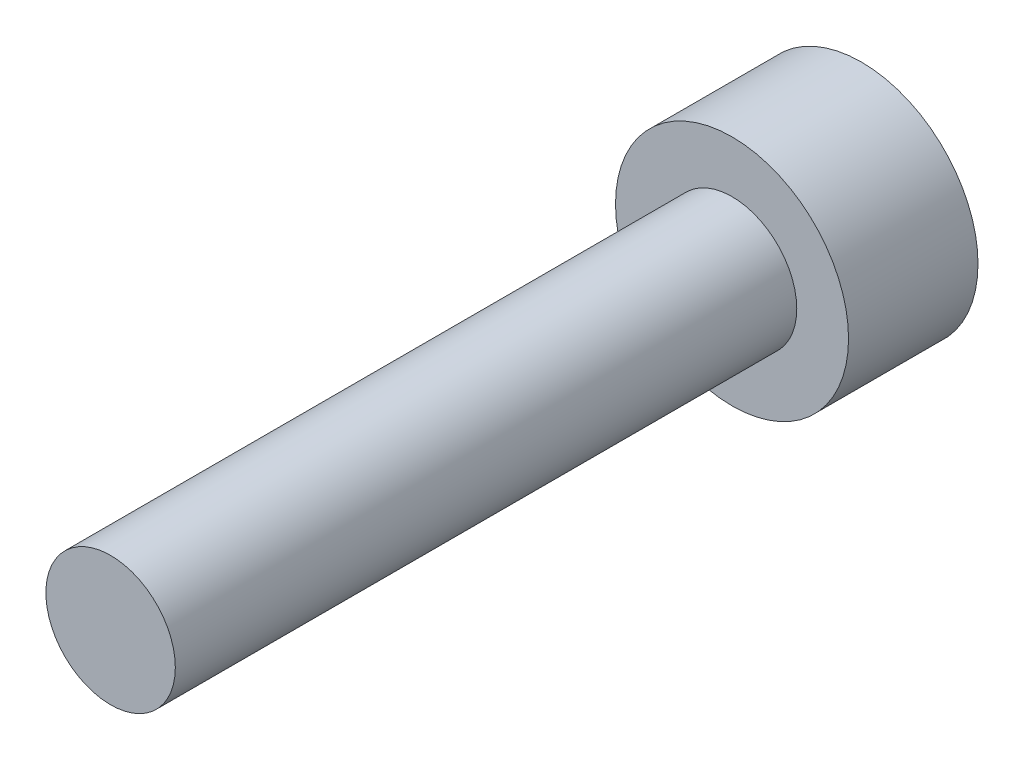
ISO-10303-21;
HEADER;
FILE_DESCRIPTION(('STEP AP214'),'2;1');
FILE_NAME('part.step','',(''),(''),'','','');
FILE_SCHEMA(('AUTOMOTIVE_DESIGN { 1 0 10303 214 1 1 1 1 }'));
ENDSEC;
DATA;
#1=APPLICATION_CONTEXT('core data for automotive mechanical design processes');
#2=APPLICATION_PROTOCOL_DEFINITION('international standard','automotive_design',2000,#1);
#3=PRODUCT_CONTEXT('',#1,'mechanical');
#4=PRODUCT('Part','Part','',(#3));
#5=PRODUCT_RELATED_PRODUCT_CATEGORY('part','',(#4));
#6=PRODUCT_DEFINITION_FORMATION('','',#4);
#7=PRODUCT_DEFINITION_CONTEXT('part definition',#1,'design');
#8=PRODUCT_DEFINITION('design','',#6,#7);
#9=PRODUCT_DEFINITION_SHAPE('','',#8);
#10=(LENGTH_UNIT() NAMED_UNIT(*) SI_UNIT(.MILLI.,.METRE.));
#11=(NAMED_UNIT(*) PLANE_ANGLE_UNIT() SI_UNIT($,.RADIAN.));
#12=(NAMED_UNIT(*) SI_UNIT($,.STERADIAN.) SOLID_ANGLE_UNIT());
#13=UNCERTAINTY_MEASURE_WITH_UNIT(LENGTH_MEASURE(1.E-05),#10,'distance_accuracy_value','');
#14=(GEOMETRIC_REPRESENTATION_CONTEXT(3) GLOBAL_UNCERTAINTY_ASSIGNED_CONTEXT((#13)) GLOBAL_UNIT_ASSIGNED_CONTEXT((#10,
#11,#12)) REPRESENTATION_CONTEXT('',''));
#15=CARTESIAN_POINT('',(0.,0.,0.));
#16=DIRECTION('',(0.,0.,1.));
#17=DIRECTION('',(1.,0.,0.));
#18=AXIS2_PLACEMENT_3D('',#15,#16,#17);
#19=CARTESIAN_POINT('',(0.,0.,2.5));
#20=DIRECTION('',(0.,0.,-1.));
#21=DIRECTION('',(-1.,0.,0.));
#22=AXIS2_PLACEMENT_3D('',#19,#20,#21);
#23=CYLINDRICAL_SURFACE('',#22,2.25);
#24=CARTESIAN_POINT('',(0.,0.,2.5));
#25=DIRECTION('',(0.,0.,1.));
#26=DIRECTION('',(1.,0.,0.));
#27=AXIS2_PLACEMENT_3D('',#24,#25,#26);
#28=CIRCLE('',#27,2.25);
#29=CARTESIAN_POINT('',(2.25,0.,2.5));
#30=VERTEX_POINT('',#29);
#31=EDGE_CURVE('E11',#30,#30,#28,.T.);
#32=ORIENTED_EDGE('',*,*,#31,.F.);
#33=EDGE_LOOP('',(#32));
#34=FACE_BOUND('',#33,.T.);
#35=CARTESIAN_POINT('',(0.,0.,0.));
#36=DIRECTION('',(0.,0.,1.));
#37=DIRECTION('',(1.,0.,0.));
#38=AXIS2_PLACEMENT_3D('',#35,#36,#37);
#39=CIRCLE('',#38,2.25);
#40=CARTESIAN_POINT('',(2.25,0.,0.));
#41=VERTEX_POINT('',#40);
#42=EDGE_CURVE('E39',#41,#41,#39,.T.);
#43=ORIENTED_EDGE('',*,*,#42,.T.);
#44=EDGE_LOOP('',(#43));
#45=FACE_BOUND('',#44,.T.);
#46=ADVANCED_FACE('F36',(#34,#45),#23,.T.);
#47=CARTESIAN_POINT('',(0.,0.,2.5));
#48=DIRECTION('',(0.,0.,1.));
#49=DIRECTION('',(1.,0.,0.));
#50=AXIS2_PLACEMENT_3D('',#47,#48,#49);
#51=PLANE('',#50);
#52=CARTESIAN_POINT('',(0.,0.,2.5));
#53=DIRECTION('',(0.,0.,1.));
#54=DIRECTION('',(1.,0.,0.));
#55=AXIS2_PLACEMENT_3D('',#52,#53,#54);
#56=CIRCLE('',#55,1.25);
#57=CARTESIAN_POINT('',(1.25,0.,2.5));
#58=VERTEX_POINT('',#57);
#59=EDGE_CURVE('E137',#58,#58,#56,.T.);
#60=ORIENTED_EDGE('',*,*,#59,.F.);
#61=EDGE_LOOP('',(#60));
#62=FACE_BOUND('',#61,.T.);
#63=ORIENTED_EDGE('',*,*,#31,.T.);
#64=EDGE_LOOP('',(#63));
#65=FACE_BOUND('',#64,.T.);
#66=ADVANCED_FACE('F151',(#62,#65),#51,.T.);
#67=CARTESIAN_POINT('',(0.,0.,0.));
#68=DIRECTION('',(0.,0.,1.));
#69=DIRECTION('',(1.,0.,0.));
#70=AXIS2_PLACEMENT_3D('',#67,#68,#69);
#71=PLANE('',#70);
#72=DIRECTION('',(0.5,0.866025403784438,0.));
#73=VECTOR('',#72,1.);
#74=CARTESIAN_POINT('',(-1.15470053837925,0.,0.));
#75=LINE('',#74,#73);
#76=CARTESIAN_POINT('',(-1.15470053837925,0.,0.));
#77=VERTEX_POINT('',#76);
#78=CARTESIAN_POINT('',(-0.577350269189626,1.,0.));
#79=VERTEX_POINT('',#78);
#80=EDGE_CURVE('E124',#77,#79,#75,.T.);
#81=ORIENTED_EDGE('',*,*,#80,.F.);
#82=DIRECTION('',(-0.5,0.866025403784439,0.));
#83=VECTOR('',#82,1.);
#84=CARTESIAN_POINT('',(-0.577350269189626,-1.,0.));
#85=LINE('',#84,#83);
#86=CARTESIAN_POINT('',(-0.577350269189626,-1.,0.));
#87=VERTEX_POINT('',#86);
#88=EDGE_CURVE('E50',#87,#77,#85,.T.);
#89=ORIENTED_EDGE('',*,*,#88,.F.);
#90=DIRECTION('',(-1.,0.,0.));
#91=VECTOR('',#90,1.);
#92=CARTESIAN_POINT('',(0.577350269189626,-1.,0.));
#93=LINE('',#92,#91);
#94=CARTESIAN_POINT('',(0.577350269189626,-1.,0.));
#95=VERTEX_POINT('',#94);
#96=EDGE_CURVE('E133',#95,#87,#93,.T.);
#97=ORIENTED_EDGE('',*,*,#96,.F.);
#98=DIRECTION('',(-0.5,-0.866025403784438,0.));
#99=VECTOR('',#98,1.);
#100=CARTESIAN_POINT('',(1.15470053837925,0.,0.));
#101=LINE('',#100,#99);
#102=CARTESIAN_POINT('',(1.15470053837925,0.,0.));
#103=VERTEX_POINT('',#102);
#104=EDGE_CURVE('E131',#103,#95,#101,.T.);
#105=ORIENTED_EDGE('',*,*,#104,.F.);
#106=DIRECTION('',(0.5,-0.866025403784439,0.));
#107=VECTOR('',#106,1.);
#108=CARTESIAN_POINT('',(0.577350269189626,1.,0.));
#109=LINE('',#108,#107);
#110=CARTESIAN_POINT('',(0.577350269189626,1.,0.));
#111=VERTEX_POINT('',#110);
#112=EDGE_CURVE('E98',#111,#103,#109,.T.);
#113=ORIENTED_EDGE('',*,*,#112,.F.);
#114=DIRECTION('',(1.,0.,0.));
#115=VECTOR('',#114,1.);
#116=CARTESIAN_POINT('',(-0.577350269189626,1.,0.));
#117=LINE('',#116,#115);
#118=EDGE_CURVE('E127',#79,#111,#117,.T.);
#119=ORIENTED_EDGE('',*,*,#118,.F.);
#120=EDGE_LOOP('',(#81,#89,#97,#105,#113,#119));
#121=FACE_BOUND('',#120,.T.);
#122=ORIENTED_EDGE('',*,*,#42,.F.);
#123=EDGE_LOOP('',(#122));
#124=FACE_BOUND('',#123,.T.);
#125=ADVANCED_FACE('F154',(#121,#124),#71,.F.);
#126=CARTESIAN_POINT('',(0.,0.,14.5));
#127=DIRECTION('',(0.,0.,-1.));
#128=DIRECTION('',(-1.,0.,0.));
#129=AXIS2_PLACEMENT_3D('',#126,#127,#128);
#130=CYLINDRICAL_SURFACE('',#129,1.25);
#131=CARTESIAN_POINT('',(0.,0.,14.5));
#132=DIRECTION('',(0.,0.,1.));
#133=DIRECTION('',(1.,0.,0.));
#134=AXIS2_PLACEMENT_3D('',#131,#132,#133);
#135=CIRCLE('',#134,1.25);
#136=CARTESIAN_POINT('',(1.25,0.,14.5));
#137=VERTEX_POINT('',#136);
#138=EDGE_CURVE('E143',#137,#137,#135,.T.);
#139=ORIENTED_EDGE('',*,*,#138,.F.);
#140=EDGE_LOOP('',(#139));
#141=FACE_BOUND('',#140,.T.);
#142=ORIENTED_EDGE('',*,*,#59,.T.);
#143=EDGE_LOOP('',(#142));
#144=FACE_BOUND('',#143,.T.);
#145=ADVANCED_FACE('F149',(#141,#144),#130,.T.);
#146=CARTESIAN_POINT('',(0.,0.,14.5));
#147=DIRECTION('',(0.,0.,1.));
#148=DIRECTION('',(1.,0.,0.));
#149=AXIS2_PLACEMENT_3D('',#146,#147,#148);
#150=PLANE('',#149);
#151=ORIENTED_EDGE('',*,*,#138,.T.);
#152=EDGE_LOOP('',(#151));
#153=FACE_BOUND('',#152,.T.);
#154=ADVANCED_FACE('F168',(#153),#150,.T.);
#155=CARTESIAN_POINT('',(-0.577350269189626,-1.,1.));
#156=DIRECTION('',(-0.866025403784439,-0.5,0.));
#157=DIRECTION('',(0.5,-0.866025403784439,0.));
#158=AXIS2_PLACEMENT_3D('',#155,#156,#157);
#159=PLANE('',#158);
#160=ORIENTED_EDGE('',*,*,#88,.T.);
#161=DIRECTION('',(0.,0.,-1.));
#162=VECTOR('',#161,1.);
#163=CARTESIAN_POINT('',(-1.15470053837925,0.,1.));
#164=LINE('',#163,#162);
#165=CARTESIAN_POINT('',(-1.15470053837925,0.,1.));
#166=VERTEX_POINT('',#165);
#167=EDGE_CURVE('E80',#166,#77,#164,.T.);
#168=ORIENTED_EDGE('',*,*,#167,.F.);
#169=DIRECTION('',(-0.5,0.866025403784439,0.));
#170=VECTOR('',#169,1.);
#171=CARTESIAN_POINT('',(-0.577350269189626,-1.,1.));
#172=LINE('',#171,#170);
#173=CARTESIAN_POINT('',(-0.577350269189626,-1.,1.));
#174=VERTEX_POINT('',#173);
#175=EDGE_CURVE('E135',#174,#166,#172,.T.);
#176=ORIENTED_EDGE('',*,*,#175,.F.);
#177=DIRECTION('',(0.,0.,-1.));
#178=VECTOR('',#177,1.);
#179=CARTESIAN_POINT('',(-0.577350269189626,-1.,1.));
#180=LINE('',#179,#178);
#181=EDGE_CURVE('E58',#174,#87,#180,.T.);
#182=ORIENTED_EDGE('',*,*,#181,.T.);
#183=EDGE_LOOP('',(#160,#168,#176,#182));
#184=FACE_BOUND('',#183,.T.);
#185=ADVANCED_FACE('F175',(#184),#159,.F.);
#186=CARTESIAN_POINT('',(0.577350269189626,-1.,1.));
#187=DIRECTION('',(0.,-1.,0.));
#188=DIRECTION('',(0.,0.,-1.));
#189=AXIS2_PLACEMENT_3D('',#186,#187,#188);
#190=PLANE('',#189);
#191=ORIENTED_EDGE('',*,*,#96,.T.);
#192=ORIENTED_EDGE('',*,*,#181,.F.);
#193=DIRECTION('',(-1.,0.,0.));
#194=VECTOR('',#193,1.);
#195=CARTESIAN_POINT('',(0.577350269189626,-1.,1.));
#196=LINE('',#195,#194);
#197=CARTESIAN_POINT('',(0.577350269189626,-1.,1.));
#198=VERTEX_POINT('',#197);
#199=EDGE_CURVE('E110',#198,#174,#196,.T.);
#200=ORIENTED_EDGE('',*,*,#199,.F.);
#201=DIRECTION('',(0.,0.,-1.));
#202=VECTOR('',#201,1.);
#203=CARTESIAN_POINT('',(0.577350269189626,-1.,1.));
#204=LINE('',#203,#202);
#205=EDGE_CURVE('E102',#198,#95,#204,.T.);
#206=ORIENTED_EDGE('',*,*,#205,.T.);
#207=EDGE_LOOP('',(#191,#192,#200,#206));
#208=FACE_BOUND('',#207,.T.);
#209=ADVANCED_FACE('F179',(#208),#190,.F.);
#210=CARTESIAN_POINT('',(1.15470053837925,0.,1.));
#211=DIRECTION('',(0.866025403784439,-0.5,0.));
#212=DIRECTION('',(0.5,0.866025403784439,0.));
#213=AXIS2_PLACEMENT_3D('',#210,#211,#212);
#214=PLANE('',#213);
#215=ORIENTED_EDGE('',*,*,#104,.T.);
#216=ORIENTED_EDGE('',*,*,#205,.F.);
#217=DIRECTION('',(-0.5,-0.866025403784438,0.));
#218=VECTOR('',#217,1.);
#219=CARTESIAN_POINT('',(1.15470053837925,0.,1.));
#220=LINE('',#219,#218);
#221=CARTESIAN_POINT('',(1.15470053837925,0.,1.));
#222=VERTEX_POINT('',#221);
#223=EDGE_CURVE('E106',#222,#198,#220,.T.);
#224=ORIENTED_EDGE('',*,*,#223,.F.);
#225=DIRECTION('',(0.,0.,-1.));
#226=VECTOR('',#225,1.);
#227=CARTESIAN_POINT('',(1.15470053837925,0.,1.));
#228=LINE('',#227,#226);
#229=EDGE_CURVE('E91',#222,#103,#228,.T.);
#230=ORIENTED_EDGE('',*,*,#229,.T.);
#231=EDGE_LOOP('',(#215,#216,#224,#230));
#232=FACE_BOUND('',#231,.T.);
#233=ADVANCED_FACE('F107',(#232),#214,.F.);
#234=CARTESIAN_POINT('',(0.577350269189626,1.,1.));
#235=DIRECTION('',(0.866025403784439,0.5,0.));
#236=DIRECTION('',(-0.5,0.866025403784439,0.));
#237=AXIS2_PLACEMENT_3D('',#234,#235,#236);
#238=PLANE('',#237);
#239=ORIENTED_EDGE('',*,*,#112,.T.);
#240=ORIENTED_EDGE('',*,*,#229,.F.);
#241=DIRECTION('',(0.5,-0.866025403784439,0.));
#242=VECTOR('',#241,1.);
#243=CARTESIAN_POINT('',(0.577350269189626,1.,1.));
#244=LINE('',#243,#242);
#245=CARTESIAN_POINT('',(0.577350269189626,1.,1.));
#246=VERTEX_POINT('',#245);
#247=EDGE_CURVE('E95',#246,#222,#244,.T.);
#248=ORIENTED_EDGE('',*,*,#247,.F.);
#249=DIRECTION('',(0.,0.,-1.));
#250=VECTOR('',#249,1.);
#251=CARTESIAN_POINT('',(0.577350269189626,1.,1.));
#252=LINE('',#251,#250);
#253=EDGE_CURVE('E103',#246,#111,#252,.T.);
#254=ORIENTED_EDGE('',*,*,#253,.T.);
#255=EDGE_LOOP('',(#239,#240,#248,#254));
#256=FACE_BOUND('',#255,.T.);
#257=ADVANCED_FACE('F93',(#256),#238,.F.);
#258=CARTESIAN_POINT('',(-0.577350269189626,1.,1.));
#259=DIRECTION('',(0.,1.,0.));
#260=DIRECTION('',(0.,0.,1.));
#261=AXIS2_PLACEMENT_3D('',#258,#259,#260);
#262=PLANE('',#261);
#263=ORIENTED_EDGE('',*,*,#118,.T.);
#264=ORIENTED_EDGE('',*,*,#253,.F.);
#265=DIRECTION('',(1.,0.,0.));
#266=VECTOR('',#265,1.);
#267=CARTESIAN_POINT('',(-0.577350269189626,1.,1.));
#268=LINE('',#267,#266);
#269=CARTESIAN_POINT('',(-0.577350269189626,1.,1.));
#270=VERTEX_POINT('',#269);
#271=EDGE_CURVE('E116',#270,#246,#268,.T.);
#272=ORIENTED_EDGE('',*,*,#271,.F.);
#273=DIRECTION('',(0.,0.,-1.));
#274=VECTOR('',#273,1.);
#275=CARTESIAN_POINT('',(-0.577350269189626,1.,1.));
#276=LINE('',#275,#274);
#277=EDGE_CURVE('E140',#270,#79,#276,.T.);
#278=ORIENTED_EDGE('',*,*,#277,.T.);
#279=EDGE_LOOP('',(#263,#264,#272,#278));
#280=FACE_BOUND('',#279,.T.);
#281=ADVANCED_FACE('F183',(#280),#262,.F.);
#282=CARTESIAN_POINT('',(-1.15470053837925,0.,1.));
#283=DIRECTION('',(-0.866025403784438,0.5,0.));
#284=DIRECTION('',(-0.5,-0.866025403784439,0.));
#285=AXIS2_PLACEMENT_3D('',#282,#283,#284);
#286=PLANE('',#285);
#287=ORIENTED_EDGE('',*,*,#80,.T.);
#288=ORIENTED_EDGE('',*,*,#277,.F.);
#289=DIRECTION('',(0.5,0.866025403784438,0.));
#290=VECTOR('',#289,1.);
#291=CARTESIAN_POINT('',(-1.15470053837925,0.,1.));
#292=LINE('',#291,#290);
#293=EDGE_CURVE('E118',#166,#270,#292,.T.);
#294=ORIENTED_EDGE('',*,*,#293,.F.);
#295=ORIENTED_EDGE('',*,*,#167,.T.);
#296=EDGE_LOOP('',(#287,#288,#294,#295));
#297=FACE_BOUND('',#296,.T.);
#298=ADVANCED_FACE('F180',(#297),#286,.F.);
#299=CARTESIAN_POINT('',(0.,0.,1.));
#300=DIRECTION('',(0.,0.,-1.));
#301=DIRECTION('',(-1.,0.,0.));
#302=AXIS2_PLACEMENT_3D('',#299,#300,#301);
#303=PLANE('',#302);
#304=ORIENTED_EDGE('',*,*,#175,.T.);
#305=ORIENTED_EDGE('',*,*,#293,.T.);
#306=ORIENTED_EDGE('',*,*,#271,.T.);
#307=ORIENTED_EDGE('',*,*,#247,.T.);
#308=ORIENTED_EDGE('',*,*,#223,.T.);
#309=ORIENTED_EDGE('',*,*,#199,.T.);
#310=EDGE_LOOP('',(#304,#305,#306,#307,#308,#309));
#311=FACE_BOUND('',#310,.T.);
#312=ADVANCED_FACE('F113',(#311),#303,.T.);
#313=CLOSED_SHELL('',(#46,#66,#125,#145,#154,#185,#209,#233,#257,#281,#298,#312));
#314=MANIFOLD_SOLID_BREP('B2',#313);
#315=ADVANCED_BREP_SHAPE_REPRESENTATION('',(#18,#314),#14);
#316=SHAPE_DEFINITION_REPRESENTATION(#9,#315);
ENDSEC;
END-ISO-10303-21;
